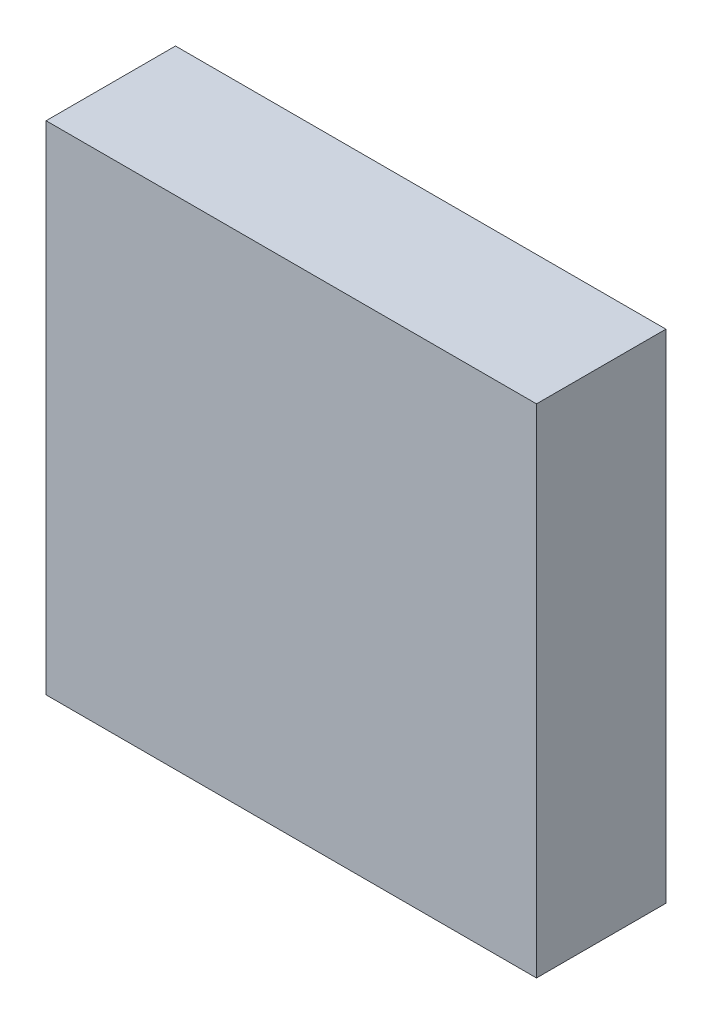
ISO-10303-21;
HEADER;
FILE_DESCRIPTION(('STEP AP214'),'2;1');
FILE_NAME('part.step','',(''),(''),'','','');
FILE_SCHEMA(('AUTOMOTIVE_DESIGN { 1 0 10303 214 1 1 1 1 }'));
ENDSEC;
DATA;
#1=APPLICATION_CONTEXT('core data for automotive mechanical design processes');
#2=APPLICATION_PROTOCOL_DEFINITION('international standard','automotive_design',2000,#1);
#3=PRODUCT_CONTEXT('',#1,'mechanical');
#4=PRODUCT('Part','Part','',(#3));
#5=PRODUCT_RELATED_PRODUCT_CATEGORY('part','',(#4));
#6=PRODUCT_DEFINITION_FORMATION('','',#4);
#7=PRODUCT_DEFINITION_CONTEXT('part definition',#1,'design');
#8=PRODUCT_DEFINITION('design','',#6,#7);
#9=PRODUCT_DEFINITION_SHAPE('','',#8);
#10=(LENGTH_UNIT() NAMED_UNIT(*) SI_UNIT(.MILLI.,.METRE.));
#11=(NAMED_UNIT(*) PLANE_ANGLE_UNIT() SI_UNIT($,.RADIAN.));
#12=(NAMED_UNIT(*) SI_UNIT($,.STERADIAN.) SOLID_ANGLE_UNIT());
#13=UNCERTAINTY_MEASURE_WITH_UNIT(LENGTH_MEASURE(1.E-05),#10,'distance_accuracy_value','');
#14=(GEOMETRIC_REPRESENTATION_CONTEXT(3) GLOBAL_UNCERTAINTY_ASSIGNED_CONTEXT((#13)) GLOBAL_UNIT_ASSIGNED_CONTEXT((#10,
#11,#12)) REPRESENTATION_CONTEXT('',''));
#15=CARTESIAN_POINT('',(0.,0.,0.));
#16=DIRECTION('',(0.,0.,1.));
#17=DIRECTION('',(1.,0.,0.));
#18=AXIS2_PLACEMENT_3D('',#15,#16,#17);
#19=CARTESIAN_POINT('',(0.,0.,0.38));
#20=DIRECTION('',(0.,0.,1.));
#21=DIRECTION('',(1.,0.,0.));
#22=AXIS2_PLACEMENT_3D('',#19,#20,#21);
#23=PLANE('',#22);
#24=DIRECTION('',(0.,1.,0.));
#25=VECTOR('',#24,1.);
#26=CARTESIAN_POINT('',(-0.72,0.73,0.38));
#27=LINE('',#26,#25);
#28=CARTESIAN_POINT('',(-0.72,-0.73,0.38));
#29=VERTEX_POINT('',#28);
#30=CARTESIAN_POINT('',(-0.72,0.73,0.38));
#31=VERTEX_POINT('',#30);
#32=EDGE_CURVE('E67',#29,#31,#27,.T.);
#33=ORIENTED_EDGE('',*,*,#32,.F.);
#34=DIRECTION('',(1.,0.,0.));
#35=VECTOR('',#34,1.);
#36=CARTESIAN_POINT('',(-0.72,-0.73,0.38));
#37=LINE('',#36,#35);
#38=CARTESIAN_POINT('',(0.72,-0.73,0.38));
#39=VERTEX_POINT('',#38);
#40=EDGE_CURVE('E19',#39,#29,#37,.F.);
#41=ORIENTED_EDGE('',*,*,#40,.F.);
#42=DIRECTION('',(0.,1.,0.));
#43=VECTOR('',#42,1.);
#44=CARTESIAN_POINT('',(0.72,-0.73,0.38));
#45=LINE('',#44,#43);
#46=CARTESIAN_POINT('',(0.72,0.73,0.38));
#47=VERTEX_POINT('',#46);
#48=EDGE_CURVE('E57',#47,#39,#45,.F.);
#49=ORIENTED_EDGE('',*,*,#48,.F.);
#50=DIRECTION('',(1.,0.,0.));
#51=VECTOR('',#50,1.);
#52=CARTESIAN_POINT('',(0.72,0.73,0.38));
#53=LINE('',#52,#51);
#54=EDGE_CURVE('E52',#31,#47,#53,.T.);
#55=ORIENTED_EDGE('',*,*,#54,.F.);
#56=EDGE_LOOP('',(#33,#41,#49,#55));
#57=FACE_BOUND('',#56,.T.);
#58=ADVANCED_FACE('F16',(#57),#23,.T.);
#59=CARTESIAN_POINT('',(-0.72,-0.73,0.));
#60=DIRECTION('',(0.,-1.,0.));
#61=DIRECTION('',(0.,0.,-1.));
#62=AXIS2_PLACEMENT_3D('',#59,#60,#61);
#63=PLANE('',#62);
#64=DIRECTION('',(0.,0.,1.));
#65=VECTOR('',#64,1.);
#66=CARTESIAN_POINT('',(-0.72,-0.73,0.));
#67=LINE('',#66,#65);
#68=CARTESIAN_POINT('',(-0.72,-0.73,0.));
#69=VERTEX_POINT('',#68);
#70=EDGE_CURVE('E78',#69,#29,#67,.T.);
#71=ORIENTED_EDGE('',*,*,#70,.F.);
#72=DIRECTION('',(1.,0.,0.));
#73=VECTOR('',#72,1.);
#74=CARTESIAN_POINT('',(0.,-0.73,0.));
#75=LINE('',#74,#73);
#76=CARTESIAN_POINT('',(0.72,-0.73,0.));
#77=VERTEX_POINT('',#76);
#78=EDGE_CURVE('E73',#69,#77,#75,.T.);
#79=ORIENTED_EDGE('',*,*,#78,.T.);
#80=DIRECTION('',(0.,0.,-1.));
#81=VECTOR('',#80,1.);
#82=CARTESIAN_POINT('',(0.72,-0.73,0.));
#83=LINE('',#82,#81);
#84=EDGE_CURVE('E62',#39,#77,#83,.T.);
#85=ORIENTED_EDGE('',*,*,#84,.F.);
#86=ORIENTED_EDGE('',*,*,#40,.T.);
#87=EDGE_LOOP('',(#71,#79,#85,#86));
#88=FACE_BOUND('',#87,.T.);
#89=ADVANCED_FACE('F72',(#88),#63,.T.);
#90=CARTESIAN_POINT('',(0.72,-0.73,0.));
#91=DIRECTION('',(1.,0.,0.));
#92=DIRECTION('',(0.,0.,-1.));
#93=AXIS2_PLACEMENT_3D('',#90,#91,#92);
#94=PLANE('',#93);
#95=ORIENTED_EDGE('',*,*,#84,.T.);
#96=DIRECTION('',(0.,1.,0.));
#97=VECTOR('',#96,1.);
#98=CARTESIAN_POINT('',(0.72,0.,0.));
#99=LINE('',#98,#97);
#100=CARTESIAN_POINT('',(0.72,0.73,0.));
#101=VERTEX_POINT('',#100);
#102=EDGE_CURVE('E83',#77,#101,#99,.T.);
#103=ORIENTED_EDGE('',*,*,#102,.T.);
#104=DIRECTION('',(0.,0.,1.));
#105=VECTOR('',#104,1.);
#106=CARTESIAN_POINT('',(0.72,0.73,0.));
#107=LINE('',#106,#105);
#108=EDGE_CURVE('E64',#47,#101,#107,.F.);
#109=ORIENTED_EDGE('',*,*,#108,.F.);
#110=ORIENTED_EDGE('',*,*,#48,.T.);
#111=EDGE_LOOP('',(#95,#103,#109,#110));
#112=FACE_BOUND('',#111,.T.);
#113=ADVANCED_FACE('F59',(#112),#94,.T.);
#114=CARTESIAN_POINT('',(0.72,0.73,0.));
#115=DIRECTION('',(0.,1.,0.));
#116=DIRECTION('',(0.,0.,1.));
#117=AXIS2_PLACEMENT_3D('',#114,#115,#116);
#118=PLANE('',#117);
#119=ORIENTED_EDGE('',*,*,#108,.T.);
#120=DIRECTION('',(1.,0.,0.));
#121=VECTOR('',#120,1.);
#122=CARTESIAN_POINT('',(0.,0.73,0.));
#123=LINE('',#122,#121);
#124=CARTESIAN_POINT('',(-0.72,0.73,0.));
#125=VERTEX_POINT('',#124);
#126=EDGE_CURVE('E25',#101,#125,#123,.F.);
#127=ORIENTED_EDGE('',*,*,#126,.T.);
#128=DIRECTION('',(0.,0.,1.));
#129=VECTOR('',#128,1.);
#130=CARTESIAN_POINT('',(-0.72,0.73,0.));
#131=LINE('',#130,#129);
#132=EDGE_CURVE('E33',#31,#125,#131,.F.);
#133=ORIENTED_EDGE('',*,*,#132,.F.);
#134=ORIENTED_EDGE('',*,*,#54,.T.);
#135=EDGE_LOOP('',(#119,#127,#133,#134));
#136=FACE_BOUND('',#135,.T.);
#137=ADVANCED_FACE('F87',(#136),#118,.T.);
#138=CARTESIAN_POINT('',(-0.72,0.73,0.));
#139=DIRECTION('',(-1.,0.,0.));
#140=DIRECTION('',(0.,0.,1.));
#141=AXIS2_PLACEMENT_3D('',#138,#139,#140);
#142=PLANE('',#141);
#143=ORIENTED_EDGE('',*,*,#132,.T.);
#144=DIRECTION('',(0.,1.,0.));
#145=VECTOR('',#144,1.);
#146=CARTESIAN_POINT('',(-0.72,0.,0.));
#147=LINE('',#146,#145);
#148=EDGE_CURVE('E11',#125,#69,#147,.F.);
#149=ORIENTED_EDGE('',*,*,#148,.T.);
#150=ORIENTED_EDGE('',*,*,#70,.T.);
#151=ORIENTED_EDGE('',*,*,#32,.T.);
#152=EDGE_LOOP('',(#143,#149,#150,#151));
#153=FACE_BOUND('',#152,.T.);
#154=ADVANCED_FACE('F90',(#153),#142,.T.);
#155=CARTESIAN_POINT('',(0.,0.,0.));
#156=DIRECTION('',(0.,0.,1.));
#157=DIRECTION('',(1.,0.,0.));
#158=AXIS2_PLACEMENT_3D('',#155,#156,#157);
#159=PLANE('',#158);
#160=ORIENTED_EDGE('',*,*,#126,.F.);
#161=ORIENTED_EDGE('',*,*,#102,.F.);
#162=ORIENTED_EDGE('',*,*,#78,.F.);
#163=ORIENTED_EDGE('',*,*,#148,.F.);
#164=EDGE_LOOP('',(#160,#161,#162,#163));
#165=FACE_BOUND('',#164,.T.);
#166=ADVANCED_FACE('F89',(#165),#159,.F.);
#167=CLOSED_SHELL('',(#58,#89,#113,#137,#154,#166));
#168=MANIFOLD_SOLID_BREP('B1',#167);
#169=ADVANCED_BREP_SHAPE_REPRESENTATION('',(#18,#168),#14);
#170=SHAPE_DEFINITION_REPRESENTATION(#9,#169);
ENDSEC;
END-ISO-10303-21;
